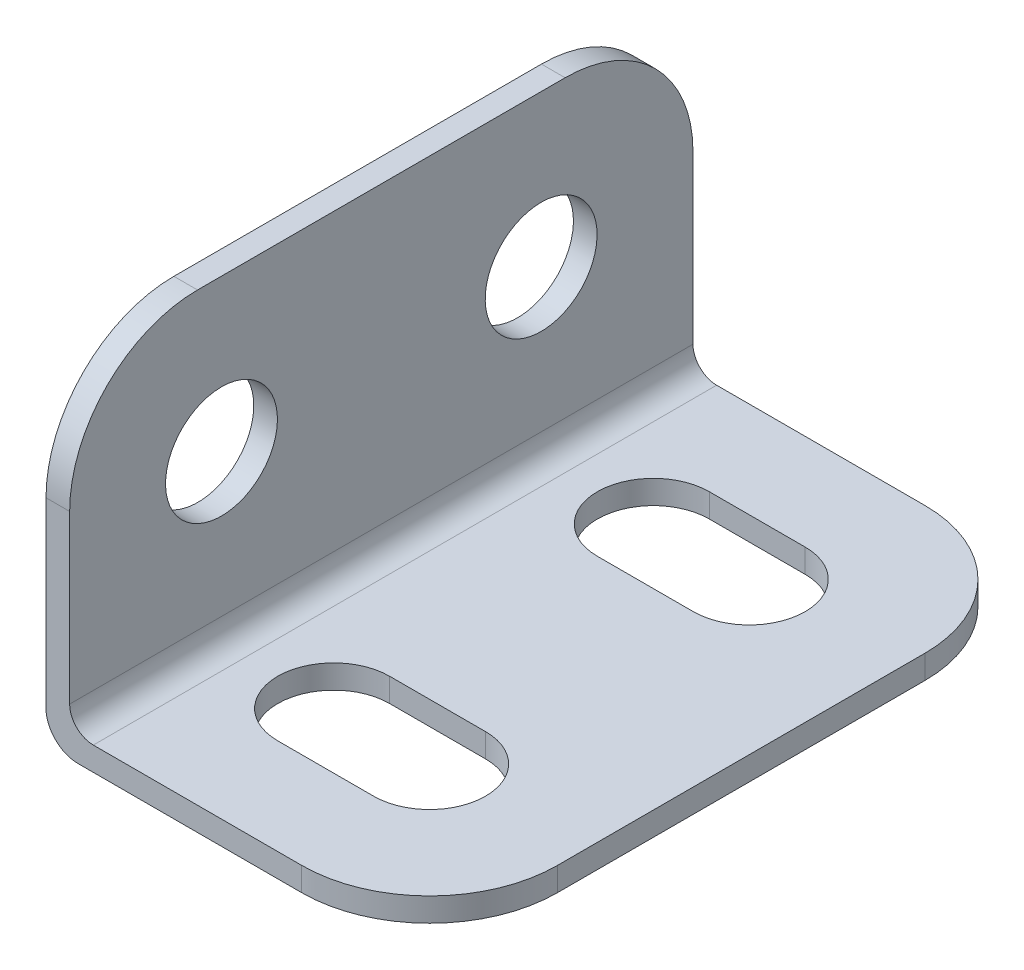
ISO-10303-21;
HEADER;
FILE_DESCRIPTION(('STEP AP214'),'2;1');
FILE_NAME('part.step','',(''),(''),'','','');
FILE_SCHEMA(('AUTOMOTIVE_DESIGN { 1 0 10303 214 1 1 1 1 }'));
ENDSEC;
DATA;
#1=APPLICATION_CONTEXT('core data for automotive mechanical design processes');
#2=APPLICATION_PROTOCOL_DEFINITION('international standard','automotive_design',2000,#1);
#3=PRODUCT_CONTEXT('',#1,'mechanical');
#4=PRODUCT('Part','Part','',(#3));
#5=PRODUCT_RELATED_PRODUCT_CATEGORY('part','',(#4));
#6=PRODUCT_DEFINITION_FORMATION('','',#4);
#7=PRODUCT_DEFINITION_CONTEXT('part definition',#1,'design');
#8=PRODUCT_DEFINITION('design','',#6,#7);
#9=PRODUCT_DEFINITION_SHAPE('','',#8);
#10=(LENGTH_UNIT() NAMED_UNIT(*) SI_UNIT(.MILLI.,.METRE.));
#11=(NAMED_UNIT(*) PLANE_ANGLE_UNIT() SI_UNIT($,.RADIAN.));
#12=(NAMED_UNIT(*) SI_UNIT($,.STERADIAN.) SOLID_ANGLE_UNIT());
#13=UNCERTAINTY_MEASURE_WITH_UNIT(LENGTH_MEASURE(1.E-05),#10,'distance_accuracy_value','');
#14=(GEOMETRIC_REPRESENTATION_CONTEXT(3) GLOBAL_UNCERTAINTY_ASSIGNED_CONTEXT((#13)) GLOBAL_UNIT_ASSIGNED_CONTEXT((#10,
#11,#12)) REPRESENTATION_CONTEXT('',''));
#15=CARTESIAN_POINT('',(0.,0.,0.));
#16=DIRECTION('',(0.,0.,1.));
#17=DIRECTION('',(1.,0.,0.));
#18=AXIS2_PLACEMENT_3D('',#15,#16,#17);
#19=CARTESIAN_POINT('',(0.9398,13.589,-24.765));
#20=DIRECTION('',(0.,1.,0.));
#21=DIRECTION('',(0.,0.,1.));
#22=AXIS2_PLACEMENT_3D('',#19,#20,#21);
#23=PLANE('',#22);
#24=DIRECTION('',(0.,0.,1.));
#25=VECTOR('',#24,1.);
#26=CARTESIAN_POINT('',(0.9398,13.589,-24.765));
#27=LINE('',#26,#25);
#28=CARTESIAN_POINT('',(0.9398,13.589,-19.685));
#29=VERTEX_POINT('',#28);
#30=CARTESIAN_POINT('',(0.9398,13.589,-5.08));
#31=VERTEX_POINT('',#30);
#32=EDGE_CURVE('E284',#29,#31,#27,.T.);
#33=ORIENTED_EDGE('',*,*,#32,.F.);
#34=DIRECTION('',(-1.,0.,0.));
#35=VECTOR('',#34,1.);
#36=CARTESIAN_POINT('',(0.,13.589,-19.685));
#37=LINE('',#36,#35);
#38=CARTESIAN_POINT('',(0.,13.589,-19.685));
#39=VERTEX_POINT('',#38);
#40=EDGE_CURVE('E307',#29,#39,#37,.T.);
#41=ORIENTED_EDGE('',*,*,#40,.T.);
#42=DIRECTION('',(0.,0.,1.));
#43=VECTOR('',#42,1.);
#44=CARTESIAN_POINT('',(0.,13.589,-24.765));
#45=LINE('',#44,#43);
#46=CARTESIAN_POINT('',(0.,13.589,-5.08));
#47=VERTEX_POINT('',#46);
#48=EDGE_CURVE('E269',#39,#47,#45,.T.);
#49=ORIENTED_EDGE('',*,*,#48,.T.);
#50=DIRECTION('',(-1.,0.,0.));
#51=VECTOR('',#50,1.);
#52=CARTESIAN_POINT('',(0.9398,13.589,-5.08));
#53=LINE('',#52,#51);
#54=EDGE_CURVE('E287',#47,#31,#53,.F.);
#55=ORIENTED_EDGE('',*,*,#54,.T.);
#56=EDGE_LOOP('',(#33,#41,#49,#55));
#57=FACE_BOUND('',#56,.T.);
#58=ADVANCED_FACE('F34',(#57),#23,.T.);
#59=CARTESIAN_POINT('',(0.939800000000002,1.8796,-24.765));
#60=DIRECTION('',(1.,0.,0.));
#61=DIRECTION('',(0.,1.,0.));
#62=AXIS2_PLACEMENT_3D('',#59,#60,#61);
#63=PLANE('',#62);
#64=CARTESIAN_POINT('',(0.939800000000001,7.5565,-18.7325));
#65=DIRECTION('',(1.,0.,0.));
#66=DIRECTION('',(0.,1.,0.));
#67=AXIS2_PLACEMENT_3D('',#64,#65,#66);
#68=CIRCLE('',#67,2.2225);
#69=CARTESIAN_POINT('',(0.9398,9.779,-18.7325));
#70=VERTEX_POINT('',#69);
#71=EDGE_CURVE('E233',#70,#70,#68,.T.);
#72=ORIENTED_EDGE('',*,*,#71,.F.);
#73=EDGE_LOOP('',(#72));
#74=FACE_BOUND('',#73,.T.);
#75=CARTESIAN_POINT('',(0.939800000000001,7.5565,-6.0325));
#76=DIRECTION('',(1.,0.,0.));
#77=DIRECTION('',(0.,1.,0.));
#78=AXIS2_PLACEMENT_3D('',#75,#76,#77);
#79=CIRCLE('',#78,2.2225);
#80=CARTESIAN_POINT('',(0.9398,9.779,-6.0325));
#81=VERTEX_POINT('',#80);
#82=EDGE_CURVE('E243',#81,#81,#79,.T.);
#83=ORIENTED_EDGE('',*,*,#82,.F.);
#84=EDGE_LOOP('',(#83));
#85=FACE_BOUND('',#84,.T.);
#86=DIRECTION('',(0.,1.,0.));
#87=VECTOR('',#86,1.);
#88=CARTESIAN_POINT('',(0.939800000000002,1.8796,-24.765));
#89=LINE('',#88,#87);
#90=CARTESIAN_POINT('',(0.939800000000002,1.8796,-24.765));
#91=VERTEX_POINT('',#90);
#92=CARTESIAN_POINT('',(0.939800000000001,8.509,-24.765));
#93=VERTEX_POINT('',#92);
#94=EDGE_CURVE('E266',#91,#93,#89,.T.);
#95=ORIENTED_EDGE('',*,*,#94,.T.);
#96=CARTESIAN_POINT('',(0.939800000000001,8.509,-19.685));
#97=DIRECTION('',(1.,0.,0.));
#98=DIRECTION('',(0.,1.,0.));
#99=AXIS2_PLACEMENT_3D('',#96,#97,#98);
#100=CIRCLE('',#99,5.08);
#101=EDGE_CURVE('E320',#93,#29,#100,.T.);
#102=ORIENTED_EDGE('',*,*,#101,.T.);
#103=ORIENTED_EDGE('',*,*,#32,.T.);
#104=CARTESIAN_POINT('',(0.939800000000001,8.509,-5.08));
#105=DIRECTION('',(1.,0.,0.));
#106=DIRECTION('',(0.,1.,0.));
#107=AXIS2_PLACEMENT_3D('',#104,#105,#106);
#108=CIRCLE('',#107,5.08);
#109=CARTESIAN_POINT('',(0.939800000000001,8.509,0.));
#110=VERTEX_POINT('',#109);
#111=EDGE_CURVE('E318',#31,#110,#108,.T.);
#112=ORIENTED_EDGE('',*,*,#111,.T.);
#113=DIRECTION('',(0.,1.,0.));
#114=VECTOR('',#113,1.);
#115=CARTESIAN_POINT('',(0.939800000000002,1.8796,0.));
#116=LINE('',#115,#114);
#117=CARTESIAN_POINT('',(0.939800000000002,1.8796,0.));
#118=VERTEX_POINT('',#117);
#119=EDGE_CURVE('E255',#118,#110,#116,.T.);
#120=ORIENTED_EDGE('',*,*,#119,.F.);
#121=DIRECTION('',(0.,0.,1.));
#122=VECTOR('',#121,1.);
#123=CARTESIAN_POINT('',(0.939800000000002,1.8796,-24.765));
#124=LINE('',#123,#122);
#125=EDGE_CURVE('E288',#91,#118,#124,.T.);
#126=ORIENTED_EDGE('',*,*,#125,.F.);
#127=EDGE_LOOP('',(#95,#102,#103,#112,#120,#126));
#128=FACE_BOUND('',#127,.T.);
#129=ADVANCED_FACE('F381',(#74,#85,#128),#63,.T.);
#130=CARTESIAN_POINT('',(1.8796,1.8796,-24.765));
#131=DIRECTION('',(0.,0.,1.));
#132=DIRECTION('',(1.,0.,0.));
#133=AXIS2_PLACEMENT_3D('',#130,#131,#132);
#134=CYLINDRICAL_SURFACE('',#133,0.9398);
#135=CARTESIAN_POINT('',(1.8796,1.8796,0.));
#136=DIRECTION('',(0.,0.,-1.));
#137=DIRECTION('',(1.,0.,0.));
#138=AXIS2_PLACEMENT_3D('',#135,#136,#137);
#139=CIRCLE('',#138,0.9398);
#140=CARTESIAN_POINT('',(1.8796,0.939800000000001,0.));
#141=VERTEX_POINT('',#140);
#142=EDGE_CURVE('E279',#141,#118,#139,.T.);
#143=ORIENTED_EDGE('',*,*,#142,.F.);
#144=DIRECTION('',(0.,0.,1.));
#145=VECTOR('',#144,1.);
#146=CARTESIAN_POINT('',(1.8796,0.939800000000001,-24.765));
#147=LINE('',#146,#145);
#148=CARTESIAN_POINT('',(1.8796,0.939800000000001,-24.765));
#149=VERTEX_POINT('',#148);
#150=EDGE_CURVE('E290',#149,#141,#147,.T.);
#151=ORIENTED_EDGE('',*,*,#150,.F.);
#152=CARTESIAN_POINT('',(1.8796,1.8796,-24.765));
#153=DIRECTION('',(0.,0.,-1.));
#154=DIRECTION('',(1.,0.,0.));
#155=AXIS2_PLACEMENT_3D('',#152,#153,#154);
#156=CIRCLE('',#155,0.9398);
#157=EDGE_CURVE('E263',#149,#91,#156,.T.);
#158=ORIENTED_EDGE('',*,*,#157,.T.);
#159=ORIENTED_EDGE('',*,*,#125,.T.);
#160=EDGE_LOOP('',(#143,#151,#158,#159));
#161=FACE_BOUND('',#160,.T.);
#162=ADVANCED_FACE('F379',(#161),#134,.F.);
#163=CARTESIAN_POINT('',(15.24,0.939800000000001,-24.765));
#164=DIRECTION('',(0.,1.,0.));
#165=DIRECTION('',(-1.,0.,0.));
#166=AXIS2_PLACEMENT_3D('',#163,#164,#165);
#167=PLANE('',#166);
#168=CARTESIAN_POINT('',(5.3975,0.939800000000001,-18.7325));
#169=DIRECTION('',(0.,1.,0.));
#170=DIRECTION('',(-1.,0.,0.));
#171=AXIS2_PLACEMENT_3D('',#168,#169,#170);
#172=CIRCLE('',#171,2.2225);
#173=CARTESIAN_POINT('',(5.3975,0.939800000000001,-20.955));
#174=VERTEX_POINT('',#173);
#175=CARTESIAN_POINT('',(5.3975,0.939800000000001,-16.51));
#176=VERTEX_POINT('',#175);
#177=EDGE_CURVE('E49',#174,#176,#172,.T.);
#178=ORIENTED_EDGE('',*,*,#177,.F.);
#179=DIRECTION('',(-1.,0.,0.));
#180=VECTOR('',#179,1.);
#181=CARTESIAN_POINT('',(9.2075,0.939800000000001,-20.955));
#182=LINE('',#181,#180);
#183=CARTESIAN_POINT('',(9.2075,0.939800000000001,-20.955));
#184=VERTEX_POINT('',#183);
#185=EDGE_CURVE('E189',#184,#174,#182,.T.);
#186=ORIENTED_EDGE('',*,*,#185,.F.);
#187=CARTESIAN_POINT('',(9.2075,0.939800000000001,-18.7325));
#188=DIRECTION('',(0.,1.,0.));
#189=DIRECTION('',(-1.,0.,0.));
#190=AXIS2_PLACEMENT_3D('',#187,#188,#189);
#191=CIRCLE('',#190,2.2225);
#192=CARTESIAN_POINT('',(9.2075,0.939800000000001,-16.51));
#193=VERTEX_POINT('',#192);
#194=EDGE_CURVE('E192',#193,#184,#191,.T.);
#195=ORIENTED_EDGE('',*,*,#194,.F.);
#196=DIRECTION('',(1.,0.,0.));
#197=VECTOR('',#196,1.);
#198=CARTESIAN_POINT('',(5.3975,0.939800000000001,-16.51));
#199=LINE('',#198,#197);
#200=EDGE_CURVE('E198',#176,#193,#199,.T.);
#201=ORIENTED_EDGE('',*,*,#200,.F.);
#202=EDGE_LOOP('',(#178,#186,#195,#201));
#203=FACE_BOUND('',#202,.T.);
#204=CARTESIAN_POINT('',(5.3975,0.939800000000001,-6.0325));
#205=DIRECTION('',(0.,1.,0.));
#206=DIRECTION('',(-1.,0.,0.));
#207=AXIS2_PLACEMENT_3D('',#204,#205,#206);
#208=CIRCLE('',#207,2.2225);
#209=CARTESIAN_POINT('',(5.3975,0.939800000000001,-8.255));
#210=VERTEX_POINT('',#209);
#211=CARTESIAN_POINT('',(5.3975,0.939800000000001,-3.81));
#212=VERTEX_POINT('',#211);
#213=EDGE_CURVE('E204',#210,#212,#208,.T.);
#214=ORIENTED_EDGE('',*,*,#213,.F.);
#215=DIRECTION('',(-1.,0.,0.));
#216=VECTOR('',#215,1.);
#217=CARTESIAN_POINT('',(9.2075,0.939800000000001,-8.255));
#218=LINE('',#217,#216);
#219=CARTESIAN_POINT('',(9.2075,0.939800000000001,-8.255));
#220=VERTEX_POINT('',#219);
#221=EDGE_CURVE('E212',#220,#210,#218,.T.);
#222=ORIENTED_EDGE('',*,*,#221,.F.);
#223=CARTESIAN_POINT('',(9.2075,0.939800000000001,-6.0325));
#224=DIRECTION('',(0.,1.,0.));
#225=DIRECTION('',(-1.,0.,0.));
#226=AXIS2_PLACEMENT_3D('',#223,#224,#225);
#227=CIRCLE('',#226,2.2225);
#228=CARTESIAN_POINT('',(9.2075,0.939800000000001,-3.81));
#229=VERTEX_POINT('',#228);
#230=EDGE_CURVE('E226',#229,#220,#227,.T.);
#231=ORIENTED_EDGE('',*,*,#230,.F.);
#232=DIRECTION('',(1.,0.,0.));
#233=VECTOR('',#232,1.);
#234=CARTESIAN_POINT('',(5.3975,0.939800000000001,-3.81));
#235=LINE('',#234,#233);
#236=EDGE_CURVE('E223',#212,#229,#235,.T.);
#237=ORIENTED_EDGE('',*,*,#236,.F.);
#238=EDGE_LOOP('',(#214,#222,#231,#237));
#239=FACE_BOUND('',#238,.T.);
#240=DIRECTION('',(0.,0.,1.));
#241=VECTOR('',#240,1.);
#242=CARTESIAN_POINT('',(15.24,0.939800000000001,-24.765));
#243=LINE('',#242,#241);
#244=CARTESIAN_POINT('',(15.24,0.939800000000001,-19.685));
#245=VERTEX_POINT('',#244);
#246=CARTESIAN_POINT('',(15.24,0.939800000000001,-5.08));
#247=VERTEX_POINT('',#246);
#248=EDGE_CURVE('E293',#245,#247,#243,.T.);
#249=ORIENTED_EDGE('',*,*,#248,.F.);
#250=CARTESIAN_POINT('',(10.16,0.939800000000001,-19.685));
#251=DIRECTION('',(0.,1.,0.));
#252=DIRECTION('',(-1.,0.,0.));
#253=AXIS2_PLACEMENT_3D('',#250,#251,#252);
#254=CIRCLE('',#253,5.08);
#255=CARTESIAN_POINT('',(10.16,0.939800000000001,-24.765));
#256=VERTEX_POINT('',#255);
#257=EDGE_CURVE('E329',#245,#256,#254,.T.);
#258=ORIENTED_EDGE('',*,*,#257,.T.);
#259=DIRECTION('',(-1.,0.,0.));
#260=VECTOR('',#259,1.);
#261=CARTESIAN_POINT('',(15.24,0.939800000000001,-24.765));
#262=LINE('',#261,#260);
#263=EDGE_CURVE('E261',#256,#149,#262,.T.);
#264=ORIENTED_EDGE('',*,*,#263,.T.);
#265=ORIENTED_EDGE('',*,*,#150,.T.);
#266=DIRECTION('',(-1.,0.,0.));
#267=VECTOR('',#266,1.);
#268=CARTESIAN_POINT('',(15.24,0.939800000000001,0.));
#269=LINE('',#268,#267);
#270=CARTESIAN_POINT('',(10.16,0.939800000000001,0.));
#271=VERTEX_POINT('',#270);
#272=EDGE_CURVE('E277',#271,#141,#269,.T.);
#273=ORIENTED_EDGE('',*,*,#272,.F.);
#274=CARTESIAN_POINT('',(10.16,0.939800000000001,-5.08));
#275=DIRECTION('',(0.,1.,0.));
#276=DIRECTION('',(-1.,0.,0.));
#277=AXIS2_PLACEMENT_3D('',#274,#275,#276);
#278=CIRCLE('',#277,5.08);
#279=EDGE_CURVE('E327',#271,#247,#278,.T.);
#280=ORIENTED_EDGE('',*,*,#279,.T.);
#281=EDGE_LOOP('',(#249,#258,#264,#265,#273,#280));
#282=FACE_BOUND('',#281,.T.);
#283=ADVANCED_FACE('F361',(#203,#239,#282),#167,.T.);
#284=CARTESIAN_POINT('',(15.24,0.,-24.765));
#285=DIRECTION('',(1.,0.,0.));
#286=DIRECTION('',(0.,0.,-1.));
#287=AXIS2_PLACEMENT_3D('',#284,#285,#286);
#288=PLANE('',#287);
#289=DIRECTION('',(0.,0.,1.));
#290=VECTOR('',#289,1.);
#291=CARTESIAN_POINT('',(15.24,0.,-24.765));
#292=LINE('',#291,#290);
#293=CARTESIAN_POINT('',(15.24,0.,-19.685));
#294=VERTEX_POINT('',#293);
#295=CARTESIAN_POINT('',(15.24,0.,-5.08));
#296=VERTEX_POINT('',#295);
#297=EDGE_CURVE('E296',#294,#296,#292,.T.);
#298=ORIENTED_EDGE('',*,*,#297,.F.);
#299=DIRECTION('',(0.,1.,0.));
#300=VECTOR('',#299,1.);
#301=CARTESIAN_POINT('',(15.24,0.939800000000001,-19.685));
#302=LINE('',#301,#300);
#303=EDGE_CURVE('E324',#294,#245,#302,.T.);
#304=ORIENTED_EDGE('',*,*,#303,.T.);
#305=ORIENTED_EDGE('',*,*,#248,.T.);
#306=DIRECTION('',(0.,1.,0.));
#307=VECTOR('',#306,1.);
#308=CARTESIAN_POINT('',(15.24,0.,-5.08));
#309=LINE('',#308,#307);
#310=EDGE_CURVE('E322',#247,#296,#309,.F.);
#311=ORIENTED_EDGE('',*,*,#310,.T.);
#312=EDGE_LOOP('',(#298,#304,#305,#311));
#313=FACE_BOUND('',#312,.T.);
#314=ADVANCED_FACE('F364',(#313),#288,.T.);
#315=CARTESIAN_POINT('',(1.27,0.,-24.765));
#316=DIRECTION('',(0.,-1.,0.));
#317=DIRECTION('',(1.,0.,0.));
#318=AXIS2_PLACEMENT_3D('',#315,#316,#317);
#319=PLANE('',#318);
#320=CARTESIAN_POINT('',(5.3975,0.,-18.7325));
#321=DIRECTION('',(0.,1.,0.));
#322=DIRECTION('',(-1.,0.,0.));
#323=AXIS2_PLACEMENT_3D('',#320,#321,#322);
#324=CIRCLE('',#323,2.2225);
#325=CARTESIAN_POINT('',(5.3975,0.,-20.955));
#326=VERTEX_POINT('',#325);
#327=CARTESIAN_POINT('',(5.3975,0.,-16.51));
#328=VERTEX_POINT('',#327);
#329=EDGE_CURVE('E173',#326,#328,#324,.T.);
#330=ORIENTED_EDGE('',*,*,#329,.T.);
#331=DIRECTION('',(1.,0.,0.));
#332=VECTOR('',#331,1.);
#333=CARTESIAN_POINT('',(5.3975,0.,-16.51));
#334=LINE('',#333,#332);
#335=CARTESIAN_POINT('',(9.2075,0.,-16.51));
#336=VERTEX_POINT('',#335);
#337=EDGE_CURVE('E182',#328,#336,#334,.T.);
#338=ORIENTED_EDGE('',*,*,#337,.T.);
#339=CARTESIAN_POINT('',(9.2075,0.,-18.7325));
#340=DIRECTION('',(0.,1.,0.));
#341=DIRECTION('',(-1.,0.,0.));
#342=AXIS2_PLACEMENT_3D('',#339,#340,#341);
#343=CIRCLE('',#342,2.2225);
#344=CARTESIAN_POINT('',(9.2075,0.,-20.955));
#345=VERTEX_POINT('',#344);
#346=EDGE_CURVE('E57',#336,#345,#343,.T.);
#347=ORIENTED_EDGE('',*,*,#346,.T.);
#348=DIRECTION('',(-1.,0.,0.));
#349=VECTOR('',#348,1.);
#350=CARTESIAN_POINT('',(9.2075,0.,-20.955));
#351=LINE('',#350,#349);
#352=EDGE_CURVE('E179',#345,#326,#351,.T.);
#353=ORIENTED_EDGE('',*,*,#352,.T.);
#354=EDGE_LOOP('',(#330,#338,#347,#353));
#355=FACE_BOUND('',#354,.T.);
#356=CARTESIAN_POINT('',(5.3975,0.,-6.0325));
#357=DIRECTION('',(0.,1.,0.));
#358=DIRECTION('',(-1.,0.,0.));
#359=AXIS2_PLACEMENT_3D('',#356,#357,#358);
#360=CIRCLE('',#359,2.2225);
#361=CARTESIAN_POINT('',(5.3975,0.,-8.255));
#362=VERTEX_POINT('',#361);
#363=CARTESIAN_POINT('',(5.3975,0.,-3.81));
#364=VERTEX_POINT('',#363);
#365=EDGE_CURVE('E208',#362,#364,#360,.T.);
#366=ORIENTED_EDGE('',*,*,#365,.T.);
#367=DIRECTION('',(1.,0.,0.));
#368=VECTOR('',#367,1.);
#369=CARTESIAN_POINT('',(5.3975,0.,-3.81));
#370=LINE('',#369,#368);
#371=CARTESIAN_POINT('',(9.2075,0.,-3.81));
#372=VERTEX_POINT('',#371);
#373=EDGE_CURVE('E211',#364,#372,#370,.T.);
#374=ORIENTED_EDGE('',*,*,#373,.T.);
#375=CARTESIAN_POINT('',(9.2075,0.,-6.0325));
#376=DIRECTION('',(0.,1.,0.));
#377=DIRECTION('',(-1.,0.,0.));
#378=AXIS2_PLACEMENT_3D('',#375,#376,#377);
#379=CIRCLE('',#378,2.2225);
#380=CARTESIAN_POINT('',(9.2075,0.,-8.255));
#381=VERTEX_POINT('',#380);
#382=EDGE_CURVE('E215',#372,#381,#379,.T.);
#383=ORIENTED_EDGE('',*,*,#382,.T.);
#384=DIRECTION('',(-1.,0.,0.));
#385=VECTOR('',#384,1.);
#386=CARTESIAN_POINT('',(9.2075,0.,-8.255));
#387=LINE('',#386,#385);
#388=EDGE_CURVE('E218',#381,#362,#387,.T.);
#389=ORIENTED_EDGE('',*,*,#388,.T.);
#390=EDGE_LOOP('',(#366,#374,#383,#389));
#391=FACE_BOUND('',#390,.T.);
#392=DIRECTION('',(1.,0.,0.));
#393=VECTOR('',#392,1.);
#394=CARTESIAN_POINT('',(1.27,0.,-24.765));
#395=LINE('',#394,#393);
#396=CARTESIAN_POINT('',(1.27,0.,-24.765));
#397=VERTEX_POINT('',#396);
#398=CARTESIAN_POINT('',(10.16,0.,-24.765));
#399=VERTEX_POINT('',#398);
#400=EDGE_CURVE('E258',#397,#399,#395,.T.);
#401=ORIENTED_EDGE('',*,*,#400,.T.);
#402=CARTESIAN_POINT('',(10.16,0.,-19.685));
#403=DIRECTION('',(0.,-1.,0.));
#404=DIRECTION('',(1.,0.,0.));
#405=AXIS2_PLACEMENT_3D('',#402,#403,#404);
#406=CIRCLE('',#405,5.08);
#407=EDGE_CURVE('E333',#399,#294,#406,.T.);
#408=ORIENTED_EDGE('',*,*,#407,.T.);
#409=ORIENTED_EDGE('',*,*,#297,.T.);
#410=CARTESIAN_POINT('',(10.16,0.,-5.08));
#411=DIRECTION('',(0.,-1.,0.));
#412=DIRECTION('',(1.,0.,0.));
#413=AXIS2_PLACEMENT_3D('',#410,#411,#412);
#414=CIRCLE('',#413,5.08);
#415=CARTESIAN_POINT('',(10.16,0.,0.));
#416=VERTEX_POINT('',#415);
#417=EDGE_CURVE('E331',#296,#416,#414,.T.);
#418=ORIENTED_EDGE('',*,*,#417,.T.);
#419=DIRECTION('',(1.,0.,0.));
#420=VECTOR('',#419,1.);
#421=CARTESIAN_POINT('',(1.27,0.,0.));
#422=LINE('',#421,#420);
#423=CARTESIAN_POINT('',(1.27,0.,0.));
#424=VERTEX_POINT('',#423);
#425=EDGE_CURVE('E274',#424,#416,#422,.T.);
#426=ORIENTED_EDGE('',*,*,#425,.F.);
#427=DIRECTION('',(0.,0.,1.));
#428=VECTOR('',#427,1.);
#429=CARTESIAN_POINT('',(1.27,0.,-24.765));
#430=LINE('',#429,#428);
#431=EDGE_CURVE('E299',#397,#424,#430,.T.);
#432=ORIENTED_EDGE('',*,*,#431,.F.);
#433=EDGE_LOOP('',(#401,#408,#409,#418,#426,#432));
#434=FACE_BOUND('',#433,.T.);
#435=ADVANCED_FACE('F186',(#355,#391,#434),#319,.T.);
#436=CARTESIAN_POINT('',(1.27,1.27,-24.765));
#437=DIRECTION('',(0.,0.,1.));
#438=DIRECTION('',(1.,0.,0.));
#439=AXIS2_PLACEMENT_3D('',#436,#437,#438);
#440=CYLINDRICAL_SURFACE('',#439,1.27);
#441=CARTESIAN_POINT('',(1.27,1.27,0.));
#442=DIRECTION('',(0.,0.,1.));
#443=DIRECTION('',(1.,0.,0.));
#444=AXIS2_PLACEMENT_3D('',#441,#442,#443);
#445=CIRCLE('',#444,1.27);
#446=CARTESIAN_POINT('',(0.,1.27,0.));
#447=VERTEX_POINT('',#446);
#448=EDGE_CURVE('E271',#447,#424,#445,.T.);
#449=ORIENTED_EDGE('',*,*,#448,.F.);
#450=DIRECTION('',(0.,0.,1.));
#451=VECTOR('',#450,1.);
#452=CARTESIAN_POINT('',(0.,1.27,-24.765));
#453=LINE('',#452,#451);
#454=CARTESIAN_POINT('',(0.,1.27,-24.765));
#455=VERTEX_POINT('',#454);
#456=EDGE_CURVE('E301',#455,#447,#453,.T.);
#457=ORIENTED_EDGE('',*,*,#456,.F.);
#458=CARTESIAN_POINT('',(1.27,1.27,-24.765));
#459=DIRECTION('',(0.,0.,1.));
#460=DIRECTION('',(1.,0.,0.));
#461=AXIS2_PLACEMENT_3D('',#458,#459,#460);
#462=CIRCLE('',#461,1.27);
#463=EDGE_CURVE('E254',#455,#397,#462,.T.);
#464=ORIENTED_EDGE('',*,*,#463,.T.);
#465=ORIENTED_EDGE('',*,*,#431,.T.);
#466=EDGE_LOOP('',(#449,#457,#464,#465));
#467=FACE_BOUND('',#466,.T.);
#468=ADVANCED_FACE('F350',(#467),#440,.T.);
#469=CARTESIAN_POINT('',(0.,13.589,-24.765));
#470=DIRECTION('',(-1.,0.,0.));
#471=DIRECTION('',(0.,-1.,0.));
#472=AXIS2_PLACEMENT_3D('',#469,#470,#471);
#473=PLANE('',#472);
#474=CARTESIAN_POINT('',(0.,7.5565,-18.7325));
#475=DIRECTION('',(1.,0.,0.));
#476=DIRECTION('',(0.,1.,0.));
#477=AXIS2_PLACEMENT_3D('',#474,#475,#476);
#478=CIRCLE('',#477,2.2225);
#479=CARTESIAN_POINT('',(0.,9.779,-18.7325));
#480=VERTEX_POINT('',#479);
#481=EDGE_CURVE('E240',#480,#480,#478,.T.);
#482=ORIENTED_EDGE('',*,*,#481,.T.);
#483=EDGE_LOOP('',(#482));
#484=FACE_BOUND('',#483,.T.);
#485=CARTESIAN_POINT('',(0.,7.5565,-6.0325));
#486=DIRECTION('',(1.,0.,0.));
#487=DIRECTION('',(0.,1.,0.));
#488=AXIS2_PLACEMENT_3D('',#485,#486,#487);
#489=CIRCLE('',#488,2.2225);
#490=CARTESIAN_POINT('',(0.,9.779,-6.0325));
#491=VERTEX_POINT('',#490);
#492=EDGE_CURVE('E246',#491,#491,#489,.T.);
#493=ORIENTED_EDGE('',*,*,#492,.T.);
#494=EDGE_LOOP('',(#493));
#495=FACE_BOUND('',#494,.T.);
#496=ORIENTED_EDGE('',*,*,#48,.F.);
#497=CARTESIAN_POINT('',(0.,8.509,-19.685));
#498=DIRECTION('',(-1.,0.,0.));
#499=DIRECTION('',(0.,-1.,0.));
#500=AXIS2_PLACEMENT_3D('',#497,#498,#499);
#501=CIRCLE('',#500,5.08);
#502=CARTESIAN_POINT('',(0.,8.509,-24.765));
#503=VERTEX_POINT('',#502);
#504=EDGE_CURVE('E312',#39,#503,#501,.T.);
#505=ORIENTED_EDGE('',*,*,#504,.T.);
#506=DIRECTION('',(0.,-1.,0.));
#507=VECTOR('',#506,1.);
#508=CARTESIAN_POINT('',(0.,13.589,-24.765));
#509=LINE('',#508,#507);
#510=EDGE_CURVE('E252',#503,#455,#509,.T.);
#511=ORIENTED_EDGE('',*,*,#510,.T.);
#512=ORIENTED_EDGE('',*,*,#456,.T.);
#513=DIRECTION('',(0.,-1.,0.));
#514=VECTOR('',#513,1.);
#515=CARTESIAN_POINT('',(0.,13.589,0.));
#516=LINE('',#515,#514);
#517=CARTESIAN_POINT('',(0.,8.509,0.));
#518=VERTEX_POINT('',#517);
#519=EDGE_CURVE('E249',#518,#447,#516,.T.);
#520=ORIENTED_EDGE('',*,*,#519,.F.);
#521=CARTESIAN_POINT('',(0.,8.509,-5.08));
#522=DIRECTION('',(-1.,0.,0.));
#523=DIRECTION('',(0.,-1.,0.));
#524=AXIS2_PLACEMENT_3D('',#521,#522,#523);
#525=CIRCLE('',#524,5.08);
#526=EDGE_CURVE('E310',#518,#47,#525,.T.);
#527=ORIENTED_EDGE('',*,*,#526,.T.);
#528=EDGE_LOOP('',(#496,#505,#511,#512,#520,#527));
#529=FACE_BOUND('',#528,.T.);
#530=ADVANCED_FACE('F344',(#484,#495,#529),#473,.T.);
#531=CARTESIAN_POINT('',(1.27,1.27,-24.765));
#532=DIRECTION('',(0.,0.,1.));
#533=DIRECTION('',(1.,0.,0.));
#534=AXIS2_PLACEMENT_3D('',#531,#532,#533);
#535=PLANE('',#534);
#536=ORIENTED_EDGE('',*,*,#510,.F.);
#537=DIRECTION('',(-1.,0.,0.));
#538=VECTOR('',#537,1.);
#539=CARTESIAN_POINT('',(0.9398,8.509,-24.765));
#540=LINE('',#539,#538);
#541=EDGE_CURVE('E316',#503,#93,#540,.F.);
#542=ORIENTED_EDGE('',*,*,#541,.T.);
#543=ORIENTED_EDGE('',*,*,#94,.F.);
#544=ORIENTED_EDGE('',*,*,#157,.F.);
#545=ORIENTED_EDGE('',*,*,#263,.F.);
#546=DIRECTION('',(0.,1.,0.));
#547=VECTOR('',#546,1.);
#548=CARTESIAN_POINT('',(10.16,0.,-24.765));
#549=LINE('',#548,#547);
#550=EDGE_CURVE('E314',#256,#399,#549,.F.);
#551=ORIENTED_EDGE('',*,*,#550,.T.);
#552=ORIENTED_EDGE('',*,*,#400,.F.);
#553=ORIENTED_EDGE('',*,*,#463,.F.);
#554=EDGE_LOOP('',(#536,#542,#543,#544,#545,#551,#552,#553));
#555=FACE_BOUND('',#554,.T.);
#556=ADVANCED_FACE('F374',(#555),#535,.F.);
#557=CARTESIAN_POINT('',(1.27,1.27,0.));
#558=DIRECTION('',(0.,0.,1.));
#559=DIRECTION('',(1.,0.,0.));
#560=AXIS2_PLACEMENT_3D('',#557,#558,#559);
#561=PLANE('',#560);
#562=ORIENTED_EDGE('',*,*,#425,.T.);
#563=DIRECTION('',(0.,1.,0.));
#564=VECTOR('',#563,1.);
#565=CARTESIAN_POINT('',(10.16,1.27,0.));
#566=LINE('',#565,#564);
#567=EDGE_CURVE('E11',#416,#271,#566,.T.);
#568=ORIENTED_EDGE('',*,*,#567,.T.);
#569=ORIENTED_EDGE('',*,*,#272,.T.);
#570=ORIENTED_EDGE('',*,*,#142,.T.);
#571=ORIENTED_EDGE('',*,*,#119,.T.);
#572=DIRECTION('',(-1.,0.,0.));
#573=VECTOR('',#572,1.);
#574=CARTESIAN_POINT('',(1.27,8.509,0.));
#575=LINE('',#574,#573);
#576=EDGE_CURVE('E42',#110,#518,#575,.T.);
#577=ORIENTED_EDGE('',*,*,#576,.T.);
#578=ORIENTED_EDGE('',*,*,#519,.T.);
#579=ORIENTED_EDGE('',*,*,#448,.T.);
#580=EDGE_LOOP('',(#562,#568,#569,#570,#571,#577,#578,#579));
#581=FACE_BOUND('',#580,.T.);
#582=ADVANCED_FACE('F338',(#581),#561,.T.);
#583=CARTESIAN_POINT('',(0.9398,8.509,-19.685));
#584=DIRECTION('',(1.,0.,0.));
#585=DIRECTION('',(0.,0.,-1.));
#586=AXIS2_PLACEMENT_3D('',#583,#584,#585);
#587=CYLINDRICAL_SURFACE('',#586,5.08);
#588=ORIENTED_EDGE('',*,*,#101,.F.);
#589=ORIENTED_EDGE('',*,*,#541,.F.);
#590=ORIENTED_EDGE('',*,*,#504,.F.);
#591=ORIENTED_EDGE('',*,*,#40,.F.);
#592=EDGE_LOOP('',(#588,#589,#590,#591));
#593=FACE_BOUND('',#592,.T.);
#594=ADVANCED_FACE('F389',(#593),#587,.T.);
#595=CARTESIAN_POINT('',(10.16,0.,-19.685));
#596=DIRECTION('',(0.,-1.,0.));
#597=DIRECTION('',(0.,0.,-1.));
#598=AXIS2_PLACEMENT_3D('',#595,#596,#597);
#599=CYLINDRICAL_SURFACE('',#598,5.08);
#600=ORIENTED_EDGE('',*,*,#407,.F.);
#601=ORIENTED_EDGE('',*,*,#550,.F.);
#602=ORIENTED_EDGE('',*,*,#257,.F.);
#603=ORIENTED_EDGE('',*,*,#303,.F.);
#604=EDGE_LOOP('',(#600,#601,#602,#603));
#605=FACE_BOUND('',#604,.T.);
#606=ADVANCED_FACE('F368',(#605),#599,.T.);
#607=CARTESIAN_POINT('',(10.16,1.27,-5.08));
#608=DIRECTION('',(0.,1.,0.));
#609=DIRECTION('',(0.,0.,1.));
#610=AXIS2_PLACEMENT_3D('',#607,#608,#609);
#611=CYLINDRICAL_SURFACE('',#610,5.08);
#612=ORIENTED_EDGE('',*,*,#417,.F.);
#613=ORIENTED_EDGE('',*,*,#310,.F.);
#614=ORIENTED_EDGE('',*,*,#279,.F.);
#615=ORIENTED_EDGE('',*,*,#567,.F.);
#616=EDGE_LOOP('',(#612,#613,#614,#615));
#617=FACE_BOUND('',#616,.T.);
#618=ADVANCED_FACE('F357',(#617),#611,.T.);
#619=CARTESIAN_POINT('',(1.27,8.509,-5.08));
#620=DIRECTION('',(-1.,0.,0.));
#621=DIRECTION('',(0.,0.,1.));
#622=AXIS2_PLACEMENT_3D('',#619,#620,#621);
#623=CYLINDRICAL_SURFACE('',#622,5.08);
#624=ORIENTED_EDGE('',*,*,#111,.F.);
#625=ORIENTED_EDGE('',*,*,#54,.F.);
#626=ORIENTED_EDGE('',*,*,#526,.F.);
#627=ORIENTED_EDGE('',*,*,#576,.F.);
#628=EDGE_LOOP('',(#624,#625,#626,#627));
#629=FACE_BOUND('',#628,.T.);
#630=ADVANCED_FACE('F36',(#629),#623,.T.);
#631=CARTESIAN_POINT('',(0.,7.5565,-6.0325));
#632=DIRECTION('',(1.,0.,0.));
#633=DIRECTION('',(0.,1.,0.));
#634=AXIS2_PLACEMENT_3D('',#631,#632,#633);
#635=CYLINDRICAL_SURFACE('',#634,2.2225);
#636=ORIENTED_EDGE('',*,*,#492,.F.);
#637=EDGE_LOOP('',(#636));
#638=FACE_BOUND('',#637,.T.);
#639=ORIENTED_EDGE('',*,*,#82,.T.);
#640=EDGE_LOOP('',(#639));
#641=FACE_BOUND('',#640,.T.);
#642=ADVANCED_FACE('F422',(#638,#641),#635,.F.);
#643=CARTESIAN_POINT('',(0.,7.5565,-18.7325));
#644=DIRECTION('',(1.,0.,0.));
#645=DIRECTION('',(0.,1.,0.));
#646=AXIS2_PLACEMENT_3D('',#643,#644,#645);
#647=CYLINDRICAL_SURFACE('',#646,2.2225);
#648=ORIENTED_EDGE('',*,*,#481,.F.);
#649=EDGE_LOOP('',(#648));
#650=FACE_BOUND('',#649,.T.);
#651=ORIENTED_EDGE('',*,*,#71,.T.);
#652=EDGE_LOOP('',(#651));
#653=FACE_BOUND('',#652,.T.);
#654=ADVANCED_FACE('F425',(#650,#653),#647,.F.);
#655=CARTESIAN_POINT('',(5.3975,0.,-6.0325));
#656=DIRECTION('',(0.,1.,0.));
#657=DIRECTION('',(-1.,0.,0.));
#658=AXIS2_PLACEMENT_3D('',#655,#656,#657);
#659=CYLINDRICAL_SURFACE('',#658,2.2225);
#660=ORIENTED_EDGE('',*,*,#213,.T.);
#661=DIRECTION('',(0.,1.,0.));
#662=VECTOR('',#661,1.);
#663=CARTESIAN_POINT('',(5.3975,0.,-3.81));
#664=LINE('',#663,#662);
#665=EDGE_CURVE('E221',#364,#212,#664,.T.);
#666=ORIENTED_EDGE('',*,*,#665,.F.);
#667=ORIENTED_EDGE('',*,*,#365,.F.);
#668=DIRECTION('',(0.,1.,0.));
#669=VECTOR('',#668,1.);
#670=CARTESIAN_POINT('',(5.3975,0.,-8.255));
#671=LINE('',#670,#669);
#672=EDGE_CURVE('E231',#362,#210,#671,.T.);
#673=ORIENTED_EDGE('',*,*,#672,.T.);
#674=EDGE_LOOP('',(#660,#666,#667,#673));
#675=FACE_BOUND('',#674,.T.);
#676=ADVANCED_FACE('F429',(#675),#659,.F.);
#677=CARTESIAN_POINT('',(9.2075,0.,-8.255));
#678=DIRECTION('',(0.,0.,-1.));
#679=DIRECTION('',(-1.,0.,0.));
#680=AXIS2_PLACEMENT_3D('',#677,#678,#679);
#681=PLANE('',#680);
#682=ORIENTED_EDGE('',*,*,#221,.T.);
#683=ORIENTED_EDGE('',*,*,#672,.F.);
#684=ORIENTED_EDGE('',*,*,#388,.F.);
#685=DIRECTION('',(0.,1.,0.));
#686=VECTOR('',#685,1.);
#687=CARTESIAN_POINT('',(9.2075,0.,-8.255));
#688=LINE('',#687,#686);
#689=EDGE_CURVE('E234',#381,#220,#688,.T.);
#690=ORIENTED_EDGE('',*,*,#689,.T.);
#691=EDGE_LOOP('',(#682,#683,#684,#690));
#692=FACE_BOUND('',#691,.T.);
#693=ADVANCED_FACE('F433',(#692),#681,.F.);
#694=CARTESIAN_POINT('',(9.2075,0.,-6.0325));
#695=DIRECTION('',(0.,1.,0.));
#696=DIRECTION('',(-1.,0.,0.));
#697=AXIS2_PLACEMENT_3D('',#694,#695,#696);
#698=CYLINDRICAL_SURFACE('',#697,2.2225);
#699=ORIENTED_EDGE('',*,*,#230,.T.);
#700=ORIENTED_EDGE('',*,*,#689,.F.);
#701=ORIENTED_EDGE('',*,*,#382,.F.);
#702=DIRECTION('',(0.,1.,0.));
#703=VECTOR('',#702,1.);
#704=CARTESIAN_POINT('',(9.2075,0.,-3.81));
#705=LINE('',#704,#703);
#706=EDGE_CURVE('E236',#372,#229,#705,.T.);
#707=ORIENTED_EDGE('',*,*,#706,.T.);
#708=EDGE_LOOP('',(#699,#700,#701,#707));
#709=FACE_BOUND('',#708,.T.);
#710=ADVANCED_FACE('F438',(#709),#698,.F.);
#711=CARTESIAN_POINT('',(5.3975,0.,-3.81));
#712=DIRECTION('',(0.,0.,1.));
#713=DIRECTION('',(1.,0.,0.));
#714=AXIS2_PLACEMENT_3D('',#711,#712,#713);
#715=PLANE('',#714);
#716=ORIENTED_EDGE('',*,*,#236,.T.);
#717=ORIENTED_EDGE('',*,*,#706,.F.);
#718=ORIENTED_EDGE('',*,*,#373,.F.);
#719=ORIENTED_EDGE('',*,*,#665,.T.);
#720=EDGE_LOOP('',(#716,#717,#718,#719));
#721=FACE_BOUND('',#720,.T.);
#722=ADVANCED_FACE('F435',(#721),#715,.F.);
#723=CARTESIAN_POINT('',(5.3975,0.,-18.7325));
#724=DIRECTION('',(0.,1.,0.));
#725=DIRECTION('',(-1.,0.,0.));
#726=AXIS2_PLACEMENT_3D('',#723,#724,#725);
#727=CYLINDRICAL_SURFACE('',#726,2.2225);
#728=ORIENTED_EDGE('',*,*,#177,.T.);
#729=DIRECTION('',(0.,1.,0.));
#730=VECTOR('',#729,1.);
#731=CARTESIAN_POINT('',(5.3975,0.,-16.51));
#732=LINE('',#731,#730);
#733=EDGE_CURVE('E169',#328,#176,#732,.T.);
#734=ORIENTED_EDGE('',*,*,#733,.F.);
#735=ORIENTED_EDGE('',*,*,#329,.F.);
#736=DIRECTION('',(0.,1.,0.));
#737=VECTOR('',#736,1.);
#738=CARTESIAN_POINT('',(5.3975,0.,-20.955));
#739=LINE('',#738,#737);
#740=EDGE_CURVE('E202',#326,#174,#739,.T.);
#741=ORIENTED_EDGE('',*,*,#740,.T.);
#742=EDGE_LOOP('',(#728,#734,#735,#741));
#743=FACE_BOUND('',#742,.T.);
#744=ADVANCED_FACE('F171',(#743),#727,.F.);
#745=CARTESIAN_POINT('',(9.2075,0.,-20.955));
#746=DIRECTION('',(0.,0.,-1.));
#747=DIRECTION('',(-1.,0.,0.));
#748=AXIS2_PLACEMENT_3D('',#745,#746,#747);
#749=PLANE('',#748);
#750=ORIENTED_EDGE('',*,*,#185,.T.);
#751=ORIENTED_EDGE('',*,*,#740,.F.);
#752=ORIENTED_EDGE('',*,*,#352,.F.);
#753=DIRECTION('',(0.,1.,0.));
#754=VECTOR('',#753,1.);
#755=CARTESIAN_POINT('',(9.2075,0.,-20.955));
#756=LINE('',#755,#754);
#757=EDGE_CURVE('E205',#345,#184,#756,.T.);
#758=ORIENTED_EDGE('',*,*,#757,.T.);
#759=EDGE_LOOP('',(#750,#751,#752,#758));
#760=FACE_BOUND('',#759,.T.);
#761=ADVANCED_FACE('F448',(#760),#749,.F.);
#762=CARTESIAN_POINT('',(9.2075,0.,-18.7325));
#763=DIRECTION('',(0.,1.,0.));
#764=DIRECTION('',(-1.,0.,0.));
#765=AXIS2_PLACEMENT_3D('',#762,#763,#764);
#766=CYLINDRICAL_SURFACE('',#765,2.2225);
#767=ORIENTED_EDGE('',*,*,#194,.T.);
#768=ORIENTED_EDGE('',*,*,#757,.F.);
#769=ORIENTED_EDGE('',*,*,#346,.F.);
#770=DIRECTION('',(0.,1.,0.));
#771=VECTOR('',#770,1.);
#772=CARTESIAN_POINT('',(9.2075,0.,-16.51));
#773=LINE('',#772,#771);
#774=EDGE_CURVE('E178',#336,#193,#773,.T.);
#775=ORIENTED_EDGE('',*,*,#774,.T.);
#776=EDGE_LOOP('',(#767,#768,#769,#775));
#777=FACE_BOUND('',#776,.T.);
#778=ADVANCED_FACE('F451',(#777),#766,.F.);
#779=CARTESIAN_POINT('',(5.3975,0.,-16.51));
#780=DIRECTION('',(0.,0.,1.));
#781=DIRECTION('',(1.,0.,0.));
#782=AXIS2_PLACEMENT_3D('',#779,#780,#781);
#783=PLANE('',#782);
#784=ORIENTED_EDGE('',*,*,#200,.T.);
#785=ORIENTED_EDGE('',*,*,#774,.F.);
#786=ORIENTED_EDGE('',*,*,#337,.F.);
#787=ORIENTED_EDGE('',*,*,#733,.T.);
#788=EDGE_LOOP('',(#784,#785,#786,#787));
#789=FACE_BOUND('',#788,.T.);
#790=ADVANCED_FACE('F183',(#789),#783,.F.);
#791=CLOSED_SHELL('',(#58,#129,#162,#283,#314,#435,#468,#530,#556,#582,#594,#606,#618,#630,#642,
#654,#676,#693,#710,#722,#744,#761,#778,#790));
#792=MANIFOLD_SOLID_BREP('B2',#791);
#793=ADVANCED_BREP_SHAPE_REPRESENTATION('',(#18,#792),#14);
#794=SHAPE_DEFINITION_REPRESENTATION(#9,#793);
ENDSEC;
END-ISO-10303-21;
